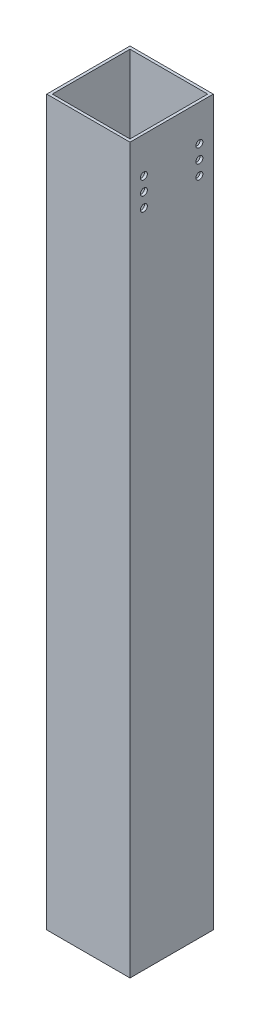
ISO-10303-21;
HEADER;
FILE_DESCRIPTION(('STEP AP214'),'2;1');
FILE_NAME('part.step','',(''),(''),'','','');
FILE_SCHEMA(('AUTOMOTIVE_DESIGN { 1 0 10303 214 1 1 1 1 }'));
ENDSEC;
DATA;
#1=APPLICATION_CONTEXT('core data for automotive mechanical design processes');
#2=APPLICATION_PROTOCOL_DEFINITION('international standard','automotive_design',2000,#1);
#3=PRODUCT_CONTEXT('',#1,'mechanical');
#4=PRODUCT('Part','Part','',(#3));
#5=PRODUCT_RELATED_PRODUCT_CATEGORY('part','',(#4));
#6=PRODUCT_DEFINITION_FORMATION('','',#4);
#7=PRODUCT_DEFINITION_CONTEXT('part definition',#1,'design');
#8=PRODUCT_DEFINITION('design','',#6,#7);
#9=PRODUCT_DEFINITION_SHAPE('','',#8);
#10=(LENGTH_UNIT() NAMED_UNIT(*) SI_UNIT(.MILLI.,.METRE.));
#11=(NAMED_UNIT(*) PLANE_ANGLE_UNIT() SI_UNIT($,.RADIAN.));
#12=(NAMED_UNIT(*) SI_UNIT($,.STERADIAN.) SOLID_ANGLE_UNIT());
#13=UNCERTAINTY_MEASURE_WITH_UNIT(LENGTH_MEASURE(1.E-05),#10,'distance_accuracy_value','');
#14=(GEOMETRIC_REPRESENTATION_CONTEXT(3) GLOBAL_UNCERTAINTY_ASSIGNED_CONTEXT((#13)) GLOBAL_UNIT_ASSIGNED_CONTEXT((#10,
#11,#12)) REPRESENTATION_CONTEXT('',''));
#15=CARTESIAN_POINT('',(0.,0.,0.));
#16=DIRECTION('',(0.,0.,1.));
#17=DIRECTION('',(1.,0.,0.));
#18=AXIS2_PLACEMENT_3D('',#15,#16,#17);
#19=CARTESIAN_POINT('',(0.,2707.5,0.));
#20=DIRECTION('',(0.,1.,0.));
#21=DIRECTION('',(0.,0.,1.));
#22=AXIS2_PLACEMENT_3D('',#19,#20,#21);
#23=PLANE('',#22);
#24=DIRECTION('',(0.,0.,-1.));
#25=VECTOR('',#24,1.);
#26=CARTESIAN_POINT('',(150.,2707.5,150.));
#27=LINE('',#26,#25);
#28=CARTESIAN_POINT('',(150.,2707.5,150.));
#29=VERTEX_POINT('',#28);
#30=CARTESIAN_POINT('',(150.,2707.5,-150.));
#31=VERTEX_POINT('',#30);
#32=EDGE_CURVE('E214',#29,#31,#27,.T.);
#33=ORIENTED_EDGE('',*,*,#32,.T.);
#34=DIRECTION('',(-1.,0.,0.));
#35=VECTOR('',#34,1.);
#36=CARTESIAN_POINT('',(-150.,2707.5,-150.));
#37=LINE('',#36,#35);
#38=CARTESIAN_POINT('',(-150.,2707.5,-150.));
#39=VERTEX_POINT('',#38);
#40=EDGE_CURVE('E218',#31,#39,#37,.T.);
#41=ORIENTED_EDGE('',*,*,#40,.T.);
#42=DIRECTION('',(0.,0.,1.));
#43=VECTOR('',#42,1.);
#44=CARTESIAN_POINT('',(-150.,2707.5,150.));
#45=LINE('',#44,#43);
#46=CARTESIAN_POINT('',(-150.,2707.5,150.));
#47=VERTEX_POINT('',#46);
#48=EDGE_CURVE('E124',#39,#47,#45,.T.);
#49=ORIENTED_EDGE('',*,*,#48,.T.);
#50=DIRECTION('',(1.,0.,0.));
#51=VECTOR('',#50,1.);
#52=CARTESIAN_POINT('',(-150.,2707.5,150.));
#53=LINE('',#52,#51);
#54=EDGE_CURVE('E223',#47,#29,#53,.T.);
#55=ORIENTED_EDGE('',*,*,#54,.T.);
#56=EDGE_LOOP('',(#33,#41,#49,#55));
#57=FACE_BOUND('',#56,.T.);
#58=DIRECTION('',(-1.,0.,0.));
#59=VECTOR('',#58,1.);
#60=CARTESIAN_POINT('',(0.,2707.5,-140.));
#61=LINE('',#60,#59);
#62=CARTESIAN_POINT('',(140.,2707.5,-140.));
#63=VERTEX_POINT('',#62);
#64=CARTESIAN_POINT('',(-140.,2707.5,-140.));
#65=VERTEX_POINT('',#64);
#66=EDGE_CURVE('E188',#63,#65,#61,.T.);
#67=ORIENTED_EDGE('',*,*,#66,.F.);
#68=DIRECTION('',(0.,0.,-1.));
#69=VECTOR('',#68,1.);
#70=CARTESIAN_POINT('',(140.,2707.5,0.));
#71=LINE('',#70,#69);
#72=CARTESIAN_POINT('',(140.,2707.5,140.));
#73=VERTEX_POINT('',#72);
#74=EDGE_CURVE('E185',#73,#63,#71,.T.);
#75=ORIENTED_EDGE('',*,*,#74,.F.);
#76=DIRECTION('',(1.,0.,0.));
#77=VECTOR('',#76,1.);
#78=CARTESIAN_POINT('',(0.,2707.5,140.));
#79=LINE('',#78,#77);
#80=CARTESIAN_POINT('',(-140.,2707.5,140.));
#81=VERTEX_POINT('',#80);
#82=EDGE_CURVE('E195',#81,#73,#79,.T.);
#83=ORIENTED_EDGE('',*,*,#82,.F.);
#84=DIRECTION('',(0.,0.,1.));
#85=VECTOR('',#84,1.);
#86=CARTESIAN_POINT('',(-140.,2707.5,0.));
#87=LINE('',#86,#85);
#88=EDGE_CURVE('E191',#65,#81,#87,.T.);
#89=ORIENTED_EDGE('',*,*,#88,.F.);
#90=EDGE_LOOP('',(#67,#75,#83,#89));
#91=FACE_BOUND('',#90,.T.);
#92=ADVANCED_FACE('F38',(#57,#91),#23,.T.);
#93=CARTESIAN_POINT('',(-150.,2707.5,-150.));
#94=DIRECTION('',(0.,0.,1.));
#95=DIRECTION('',(1.,0.,0.));
#96=AXIS2_PLACEMENT_3D('',#93,#94,#95);
#97=PLANE('',#96);
#98=DIRECTION('',(0.,-1.,0.));
#99=VECTOR('',#98,1.);
#100=CARTESIAN_POINT('',(150.,2707.5,-150.));
#101=LINE('',#100,#99);
#102=CARTESIAN_POINT('',(150.,100.000000000001,-150.));
#103=VERTEX_POINT('',#102);
#104=EDGE_CURVE('E11',#31,#103,#101,.T.);
#105=ORIENTED_EDGE('',*,*,#104,.T.);
#106=DIRECTION('',(-1.,0.,0.));
#107=VECTOR('',#106,1.);
#108=CARTESIAN_POINT('',(-150.,100.,-150.));
#109=LINE('',#108,#107);
#110=CARTESIAN_POINT('',(-150.,100.,-150.));
#111=VERTEX_POINT('',#110);
#112=EDGE_CURVE('E64',#103,#111,#109,.T.);
#113=ORIENTED_EDGE('',*,*,#112,.T.);
#114=DIRECTION('',(0.,-1.,0.));
#115=VECTOR('',#114,1.);
#116=CARTESIAN_POINT('',(-150.,2707.5,-150.));
#117=LINE('',#116,#115);
#118=EDGE_CURVE('E48',#39,#111,#117,.T.);
#119=ORIENTED_EDGE('',*,*,#118,.F.);
#120=ORIENTED_EDGE('',*,*,#40,.F.);
#121=EDGE_LOOP('',(#105,#113,#119,#120));
#122=FACE_BOUND('',#121,.T.);
#123=ADVANCED_FACE('F118',(#122),#97,.F.);
#124=CARTESIAN_POINT('',(-150.,2707.5,150.));
#125=DIRECTION('',(1.,0.,0.));
#126=DIRECTION('',(0.,0.,-1.));
#127=AXIS2_PLACEMENT_3D('',#124,#125,#126);
#128=PLANE('',#127);
#129=ORIENTED_EDGE('',*,*,#118,.T.);
#130=DIRECTION('',(0.,0.,1.));
#131=VECTOR('',#130,1.);
#132=CARTESIAN_POINT('',(-150.,100.,-150.));
#133=LINE('',#132,#131);
#134=CARTESIAN_POINT('',(-150.,100.,150.));
#135=VERTEX_POINT('',#134);
#136=EDGE_CURVE('E104',#111,#135,#133,.T.);
#137=ORIENTED_EDGE('',*,*,#136,.T.);
#138=DIRECTION('',(0.,-1.,0.));
#139=VECTOR('',#138,1.);
#140=CARTESIAN_POINT('',(-150.,2707.5,150.));
#141=LINE('',#140,#139);
#142=EDGE_CURVE('E126',#47,#135,#141,.T.);
#143=ORIENTED_EDGE('',*,*,#142,.F.);
#144=ORIENTED_EDGE('',*,*,#48,.F.);
#145=EDGE_LOOP('',(#129,#137,#143,#144));
#146=FACE_BOUND('',#145,.T.);
#147=ADVANCED_FACE('F123',(#146),#128,.F.);
#148=CARTESIAN_POINT('',(-150.,2707.5,150.));
#149=DIRECTION('',(0.,0.,-1.));
#150=DIRECTION('',(-1.,0.,0.));
#151=AXIS2_PLACEMENT_3D('',#148,#149,#150);
#152=PLANE('',#151);
#153=ORIENTED_EDGE('',*,*,#142,.T.);
#154=DIRECTION('',(-1.,0.,0.));
#155=VECTOR('',#154,1.);
#156=CARTESIAN_POINT('',(-150.,100.,150.));
#157=LINE('',#156,#155);
#158=CARTESIAN_POINT('',(150.,100.,150.));
#159=VERTEX_POINT('',#158);
#160=EDGE_CURVE('E107',#159,#135,#157,.T.);
#161=ORIENTED_EDGE('',*,*,#160,.F.);
#162=DIRECTION('',(0.,-1.,0.));
#163=VECTOR('',#162,1.);
#164=CARTESIAN_POINT('',(150.,2707.5,150.));
#165=LINE('',#164,#163);
#166=EDGE_CURVE('E129',#29,#159,#165,.T.);
#167=ORIENTED_EDGE('',*,*,#166,.F.);
#168=ORIENTED_EDGE('',*,*,#54,.F.);
#169=EDGE_LOOP('',(#153,#161,#167,#168));
#170=FACE_BOUND('',#169,.T.);
#171=ADVANCED_FACE('F232',(#170),#152,.F.);
#172=CARTESIAN_POINT('',(140.,2707.5,0.));
#173=DIRECTION('',(-1.,0.,0.));
#174=DIRECTION('',(0.,0.,1.));
#175=AXIS2_PLACEMENT_3D('',#172,#173,#174);
#176=PLANE('',#175);
#177=DIRECTION('',(0.,0.,-1.));
#178=VECTOR('',#177,1.);
#179=CARTESIAN_POINT('',(140.,100.,0.));
#180=LINE('',#179,#178);
#181=CARTESIAN_POINT('',(140.,100.,140.));
#182=VERTEX_POINT('',#181);
#183=CARTESIAN_POINT('',(140.,100.,-140.));
#184=VERTEX_POINT('',#183);
#185=EDGE_CURVE('E169',#182,#184,#180,.T.);
#186=ORIENTED_EDGE('',*,*,#185,.F.);
#187=DIRECTION('',(0.,-1.,0.));
#188=VECTOR('',#187,1.);
#189=CARTESIAN_POINT('',(140.,2707.5,140.));
#190=LINE('',#189,#188);
#191=EDGE_CURVE('E198',#73,#182,#190,.T.);
#192=ORIENTED_EDGE('',*,*,#191,.F.);
#193=ORIENTED_EDGE('',*,*,#74,.T.);
#194=DIRECTION('',(0.,-1.,0.));
#195=VECTOR('',#194,1.);
#196=CARTESIAN_POINT('',(140.,2707.5,-140.));
#197=LINE('',#196,#195);
#198=EDGE_CURVE('E210',#63,#184,#197,.T.);
#199=ORIENTED_EDGE('',*,*,#198,.T.);
#200=EDGE_LOOP('',(#186,#192,#193,#199));
#201=FACE_BOUND('',#200,.T.);
#202=CARTESIAN_POINT('',(140.,2577.5,-100.));
#203=DIRECTION('',(-1.,0.,0.));
#204=DIRECTION('',(0.,0.,1.));
#205=AXIS2_PLACEMENT_3D('',#202,#203,#204);
#206=CIRCLE('',#205,12.5000000000002);
#207=CARTESIAN_POINT('',(140.,2577.5,-112.5));
#208=VERTEX_POINT('',#207);
#209=EDGE_CURVE('E42',#208,#208,#206,.T.);
#210=ORIENTED_EDGE('',*,*,#209,.F.);
#211=EDGE_LOOP('',(#210));
#212=FACE_BOUND('',#211,.T.);
#213=CARTESIAN_POINT('',(140.,2527.5,-100.));
#214=DIRECTION('',(-1.,0.,0.));
#215=DIRECTION('',(0.,0.,1.));
#216=AXIS2_PLACEMENT_3D('',#213,#214,#215);
#217=CIRCLE('',#216,12.5000000000002);
#218=CARTESIAN_POINT('',(140.,2527.5,-112.5));
#219=VERTEX_POINT('',#218);
#220=EDGE_CURVE('E153',#219,#219,#217,.T.);
#221=ORIENTED_EDGE('',*,*,#220,.F.);
#222=EDGE_LOOP('',(#221));
#223=FACE_BOUND('',#222,.T.);
#224=CARTESIAN_POINT('',(140.,2477.5,-100.));
#225=DIRECTION('',(-1.,0.,0.));
#226=DIRECTION('',(0.,0.,1.));
#227=AXIS2_PLACEMENT_3D('',#224,#225,#226);
#228=CIRCLE('',#227,12.5000000000002);
#229=CARTESIAN_POINT('',(140.,2477.5,-112.5));
#230=VERTEX_POINT('',#229);
#231=EDGE_CURVE('E149',#230,#230,#228,.T.);
#232=ORIENTED_EDGE('',*,*,#231,.F.);
#233=EDGE_LOOP('',(#232));
#234=FACE_BOUND('',#233,.T.);
#235=CARTESIAN_POINT('',(140.,2577.5,100.));
#236=DIRECTION('',(-1.,0.,0.));
#237=DIRECTION('',(0.,0.,1.));
#238=AXIS2_PLACEMENT_3D('',#235,#236,#237);
#239=CIRCLE('',#238,12.5000000000002);
#240=CARTESIAN_POINT('',(140.,2577.5,87.4999999999998));
#241=VERTEX_POINT('',#240);
#242=EDGE_CURVE('E144',#241,#241,#239,.T.);
#243=ORIENTED_EDGE('',*,*,#242,.F.);
#244=EDGE_LOOP('',(#243));
#245=FACE_BOUND('',#244,.T.);
#246=CARTESIAN_POINT('',(140.,2527.5,100.));
#247=DIRECTION('',(-1.,0.,0.));
#248=DIRECTION('',(0.,0.,1.));
#249=AXIS2_PLACEMENT_3D('',#246,#247,#248);
#250=CIRCLE('',#249,12.5000000000002);
#251=CARTESIAN_POINT('',(140.,2527.5,87.4999999999998));
#252=VERTEX_POINT('',#251);
#253=EDGE_CURVE('E139',#252,#252,#250,.T.);
#254=ORIENTED_EDGE('',*,*,#253,.F.);
#255=EDGE_LOOP('',(#254));
#256=FACE_BOUND('',#255,.T.);
#257=CARTESIAN_POINT('',(140.,2477.5,100.));
#258=DIRECTION('',(-1.,0.,0.));
#259=DIRECTION('',(0.,0.,1.));
#260=AXIS2_PLACEMENT_3D('',#257,#258,#259);
#261=CIRCLE('',#260,12.5000000000002);
#262=CARTESIAN_POINT('',(140.,2477.5,87.4999999999998));
#263=VERTEX_POINT('',#262);
#264=EDGE_CURVE('E137',#263,#263,#261,.T.);
#265=ORIENTED_EDGE('',*,*,#264,.F.);
#266=EDGE_LOOP('',(#265));
#267=FACE_BOUND('',#266,.T.);
#268=ADVANCED_FACE('F253',(#201,#212,#223,#234,#245,#256,#267),#176,.T.);
#269=CARTESIAN_POINT('',(0.,2707.5,-140.));
#270=DIRECTION('',(0.,0.,1.));
#271=DIRECTION('',(1.,0.,0.));
#272=AXIS2_PLACEMENT_3D('',#269,#270,#271);
#273=PLANE('',#272);
#274=DIRECTION('',(-1.,0.,0.));
#275=VECTOR('',#274,1.);
#276=CARTESIAN_POINT('',(7.23726634177524E-13,100.,-140.));
#277=LINE('',#276,#275);
#278=CARTESIAN_POINT('',(-140.,100.,-140.));
#279=VERTEX_POINT('',#278);
#280=EDGE_CURVE('E241',#184,#279,#277,.T.);
#281=ORIENTED_EDGE('',*,*,#280,.F.);
#282=ORIENTED_EDGE('',*,*,#198,.F.);
#283=ORIENTED_EDGE('',*,*,#66,.T.);
#284=DIRECTION('',(0.,-1.,0.));
#285=VECTOR('',#284,1.);
#286=CARTESIAN_POINT('',(-140.,2707.5,-140.));
#287=LINE('',#286,#285);
#288=EDGE_CURVE('E206',#65,#279,#287,.T.);
#289=ORIENTED_EDGE('',*,*,#288,.T.);
#290=EDGE_LOOP('',(#281,#282,#283,#289));
#291=FACE_BOUND('',#290,.T.);
#292=ADVANCED_FACE('F250',(#291),#273,.T.);
#293=CARTESIAN_POINT('',(-140.,2707.5,0.));
#294=DIRECTION('',(1.,0.,0.));
#295=DIRECTION('',(0.,0.,-1.));
#296=AXIS2_PLACEMENT_3D('',#293,#294,#295);
#297=PLANE('',#296);
#298=DIRECTION('',(0.,0.,1.));
#299=VECTOR('',#298,1.);
#300=CARTESIAN_POINT('',(-140.,100.,0.));
#301=LINE('',#300,#299);
#302=CARTESIAN_POINT('',(-140.,100.000000000001,140.));
#303=VERTEX_POINT('',#302);
#304=EDGE_CURVE('E56',#279,#303,#301,.T.);
#305=ORIENTED_EDGE('',*,*,#304,.F.);
#306=ORIENTED_EDGE('',*,*,#288,.F.);
#307=ORIENTED_EDGE('',*,*,#88,.T.);
#308=DIRECTION('',(0.,-1.,0.));
#309=VECTOR('',#308,1.);
#310=CARTESIAN_POINT('',(-140.,2707.5,140.));
#311=LINE('',#310,#309);
#312=EDGE_CURVE('E202',#81,#303,#311,.T.);
#313=ORIENTED_EDGE('',*,*,#312,.T.);
#314=EDGE_LOOP('',(#305,#306,#307,#313));
#315=FACE_BOUND('',#314,.T.);
#316=ADVANCED_FACE('F260',(#315),#297,.T.);
#317=CARTESIAN_POINT('',(0.,2707.5,140.));
#318=DIRECTION('',(0.,0.,-1.));
#319=DIRECTION('',(-1.,0.,0.));
#320=AXIS2_PLACEMENT_3D('',#317,#318,#319);
#321=PLANE('',#320);
#322=DIRECTION('',(1.,0.,0.));
#323=VECTOR('',#322,1.);
#324=CARTESIAN_POINT('',(7.23726634177524E-13,100.,140.));
#325=LINE('',#324,#323);
#326=EDGE_CURVE('E113',#303,#182,#325,.T.);
#327=ORIENTED_EDGE('',*,*,#326,.F.);
#328=ORIENTED_EDGE('',*,*,#312,.F.);
#329=ORIENTED_EDGE('',*,*,#82,.T.);
#330=ORIENTED_EDGE('',*,*,#191,.T.);
#331=EDGE_LOOP('',(#327,#328,#329,#330));
#332=FACE_BOUND('',#331,.T.);
#333=ADVANCED_FACE('F262',(#332),#321,.T.);
#334=CARTESIAN_POINT('',(160.,2477.5,100.));
#335=DIRECTION('',(1.,0.,0.));
#336=DIRECTION('',(0.,0.,-1.));
#337=AXIS2_PLACEMENT_3D('',#334,#335,#336);
#338=CYLINDRICAL_SURFACE('',#337,12.5000000000002);
#339=CARTESIAN_POINT('',(150.,2477.5,100.));
#340=DIRECTION('',(-1.,0.,0.));
#341=DIRECTION('',(0.,0.,1.));
#342=AXIS2_PLACEMENT_3D('',#339,#340,#341);
#343=CIRCLE('',#342,12.5000000000002);
#344=CARTESIAN_POINT('',(150.,2477.5,87.4999999999998));
#345=VERTEX_POINT('',#344);
#346=EDGE_CURVE('E133',#345,#345,#343,.T.);
#347=CARTESIAN_POINT('',(140.,2477.5,87.4999999999998));
#348=CARTESIAN_POINT('',(140.104166666667,2477.5,87.4999999999998));
#349=CARTESIAN_POINT('',(140.208333333333,2477.5,87.4999999999998));
#350=CARTESIAN_POINT('',(140.416666666667,2477.5,87.4999999999998));
#351=CARTESIAN_POINT('',(140.520833333333,2477.5,87.4999999999998));
#352=CARTESIAN_POINT('',(140.729166666667,2477.5,87.4999999999998));
#353=CARTESIAN_POINT('',(140.833333333333,2477.5,87.4999999999998));
#354=CARTESIAN_POINT('',(141.041666666667,2477.5,87.4999999999998));
#355=CARTESIAN_POINT('',(141.145833333333,2477.5,87.4999999999998));
#356=CARTESIAN_POINT('',(141.354166666667,2477.5,87.4999999999998));
#357=CARTESIAN_POINT('',(141.458333333333,2477.5,87.4999999999998));
#358=CARTESIAN_POINT('',(141.666666666667,2477.5,87.4999999999998));
#359=CARTESIAN_POINT('',(141.770833333333,2477.5,87.4999999999998));
#360=CARTESIAN_POINT('',(141.979166666667,2477.5,87.4999999999998));
#361=CARTESIAN_POINT('',(142.083333333333,2477.5,87.4999999999998));
#362=CARTESIAN_POINT('',(142.291666666667,2477.5,87.4999999999998));
#363=CARTESIAN_POINT('',(142.395833333333,2477.5,87.4999999999998));
#364=CARTESIAN_POINT('',(142.604166666667,2477.5,87.4999999999998));
#365=CARTESIAN_POINT('',(142.708333333333,2477.5,87.4999999999998));
#366=CARTESIAN_POINT('',(142.916666666667,2477.5,87.4999999999998));
#367=CARTESIAN_POINT('',(143.020833333333,2477.5,87.4999999999998));
#368=CARTESIAN_POINT('',(143.229166666667,2477.5,87.4999999999998));
#369=CARTESIAN_POINT('',(143.333333333333,2477.5,87.4999999999998));
#370=CARTESIAN_POINT('',(143.541666666667,2477.5,87.4999999999998));
#371=CARTESIAN_POINT('',(143.645833333333,2477.5,87.4999999999998));
#372=CARTESIAN_POINT('',(143.854166666667,2477.5,87.4999999999998));
#373=CARTESIAN_POINT('',(143.958333333333,2477.5,87.4999999999998));
#374=CARTESIAN_POINT('',(144.166666666667,2477.5,87.4999999999998));
#375=CARTESIAN_POINT('',(144.270833333333,2477.5,87.4999999999998));
#376=CARTESIAN_POINT('',(144.479166666667,2477.5,87.4999999999998));
#377=CARTESIAN_POINT('',(144.583333333333,2477.5,87.4999999999998));
#378=CARTESIAN_POINT('',(144.791666666667,2477.5,87.4999999999998));
#379=CARTESIAN_POINT('',(144.895833333333,2477.5,87.4999999999998));
#380=CARTESIAN_POINT('',(145.104166666667,2477.5,87.4999999999998));
#381=CARTESIAN_POINT('',(145.208333333333,2477.5,87.4999999999998));
#382=CARTESIAN_POINT('',(145.416666666667,2477.5,87.4999999999998));
#383=CARTESIAN_POINT('',(145.520833333333,2477.5,87.4999999999998));
#384=CARTESIAN_POINT('',(145.729166666667,2477.5,87.4999999999998));
#385=CARTESIAN_POINT('',(145.833333333333,2477.5,87.4999999999998));
#386=CARTESIAN_POINT('',(146.041666666667,2477.5,87.4999999999998));
#387=CARTESIAN_POINT('',(146.145833333333,2477.5,87.4999999999998));
#388=CARTESIAN_POINT('',(146.354166666667,2477.5,87.4999999999998));
#389=CARTESIAN_POINT('',(146.458333333333,2477.5,87.4999999999998));
#390=CARTESIAN_POINT('',(146.666666666667,2477.5,87.4999999999998));
#391=CARTESIAN_POINT('',(146.770833333333,2477.5,87.4999999999998));
#392=CARTESIAN_POINT('',(146.979166666667,2477.5,87.4999999999998));
#393=CARTESIAN_POINT('',(147.083333333333,2477.5,87.4999999999998));
#394=CARTESIAN_POINT('',(147.291666666667,2477.5,87.4999999999998));
#395=CARTESIAN_POINT('',(147.395833333333,2477.5,87.4999999999998));
#396=CARTESIAN_POINT('',(147.604166666667,2477.5,87.4999999999998));
#397=CARTESIAN_POINT('',(147.708333333333,2477.5,87.4999999999998));
#398=CARTESIAN_POINT('',(147.916666666667,2477.5,87.4999999999998));
#399=CARTESIAN_POINT('',(148.020833333333,2477.5,87.4999999999998));
#400=CARTESIAN_POINT('',(148.229166666667,2477.5,87.4999999999998));
#401=CARTESIAN_POINT('',(148.333333333333,2477.5,87.4999999999998));
#402=CARTESIAN_POINT('',(148.541666666667,2477.5,87.4999999999998));
#403=CARTESIAN_POINT('',(148.645833333333,2477.5,87.4999999999998));
#404=CARTESIAN_POINT('',(148.854166666667,2477.5,87.4999999999998));
#405=CARTESIAN_POINT('',(148.958333333333,2477.5,87.4999999999998));
#406=CARTESIAN_POINT('',(149.166666666667,2477.5,87.4999999999998));
#407=CARTESIAN_POINT('',(149.270833333333,2477.5,87.4999999999998));
#408=CARTESIAN_POINT('',(149.479166666667,2477.5,87.4999999999998));
#409=CARTESIAN_POINT('',(149.583333333333,2477.5,87.4999999999998));
#410=CARTESIAN_POINT('',(149.791666666667,2477.5,87.4999999999998));
#411=CARTESIAN_POINT('',(149.895833333333,2477.5,87.4999999999998));
#412=CARTESIAN_POINT('',(150.,2477.5,87.4999999999998));
#413=B_SPLINE_CURVE_WITH_KNOTS('',3,(#347,#348,#349,#350,#351,#352,#353,#354,#355,#356,#357,
#358,#359,#360,#361,#362,#363,#364,#365,#366,#367,#368,#369,#370,#371,#372,#373,#374,#375,#376,
#377,#378,#379,#380,#381,#382,#383,#384,#385,#386,#387,#388,#389,#390,#391,#392,#393,#394,#395,
#396,#397,#398,#399,#400,#401,#402,#403,#404,#405,#406,#407,#408,#409,#410,#411,#412),
.UNSPECIFIED.,.F.,.F.,(4,2,2,2,2,2,2,2,2,2,2,2,2,2,2,2,2,2,2,2,2,2,2,2,2,2,2,2,2,2,2,2,4),(0.,
0.312500000000021,0.625000000000014,0.937500000000008,1.25000000000003,1.56250000000002,
1.87500000000002,2.18750000000001,2.5,2.81250000000002,3.12500000000002,3.43750000000001,
3.75000000000003,4.06250000000002,4.37500000000002,4.68750000000001,5.,5.31250000000003,
5.62500000000002,5.93750000000001,6.25000000000003,6.56250000000003,6.87500000000002,
7.18750000000001,7.50000000000001,7.81250000000003,8.12500000000002,8.43750000000001,
8.75000000000004,9.06250000000003,9.37500000000002,9.68750000000002,10.),.UNSPECIFIED.);
#414=EDGE_CURVE('BSEAM264',#263,#345,#413,.T.);
#415=ORIENTED_EDGE('',*,*,#264,.T.);
#416=ORIENTED_EDGE('',*,*,#346,.F.);
#417=ORIENTED_EDGE('',*,*,#414,.T.);
#418=ORIENTED_EDGE('',*,*,#414,.F.);
#419=EDGE_LOOP('',(#415,#417,#416,#418));
#420=FACE_BOUND('',#419,.T.);
#421=ADVANCED_FACE('F264',(#420),#338,.F.);
#422=CARTESIAN_POINT('',(160.,2527.5,100.));
#423=DIRECTION('',(1.,0.,0.));
#424=DIRECTION('',(0.,0.,-1.));
#425=AXIS2_PLACEMENT_3D('',#422,#423,#424);
#426=CYLINDRICAL_SURFACE('',#425,12.5000000000002);
#427=CARTESIAN_POINT('',(150.,2527.5,100.));
#428=DIRECTION('',(-1.,0.,0.));
#429=DIRECTION('',(0.,0.,1.));
#430=AXIS2_PLACEMENT_3D('',#427,#428,#429);
#431=CIRCLE('',#430,12.5000000000002);
#432=CARTESIAN_POINT('',(150.,2527.5,87.4999999999998));
#433=VERTEX_POINT('',#432);
#434=EDGE_CURVE('E138',#433,#433,#431,.T.);
#435=CARTESIAN_POINT('',(140.,2527.5,87.4999999999998));
#436=CARTESIAN_POINT('',(140.104166666667,2527.5,87.4999999999998));
#437=CARTESIAN_POINT('',(140.208333333333,2527.5,87.4999999999998));
#438=CARTESIAN_POINT('',(140.416666666667,2527.5,87.4999999999998));
#439=CARTESIAN_POINT('',(140.520833333333,2527.5,87.4999999999998));
#440=CARTESIAN_POINT('',(140.729166666667,2527.5,87.4999999999998));
#441=CARTESIAN_POINT('',(140.833333333333,2527.5,87.4999999999998));
#442=CARTESIAN_POINT('',(141.041666666667,2527.5,87.4999999999998));
#443=CARTESIAN_POINT('',(141.145833333333,2527.5,87.4999999999998));
#444=CARTESIAN_POINT('',(141.354166666667,2527.5,87.4999999999998));
#445=CARTESIAN_POINT('',(141.458333333333,2527.5,87.4999999999998));
#446=CARTESIAN_POINT('',(141.666666666667,2527.5,87.4999999999998));
#447=CARTESIAN_POINT('',(141.770833333333,2527.5,87.4999999999998));
#448=CARTESIAN_POINT('',(141.979166666667,2527.5,87.4999999999998));
#449=CARTESIAN_POINT('',(142.083333333333,2527.5,87.4999999999998));
#450=CARTESIAN_POINT('',(142.291666666667,2527.5,87.4999999999998));
#451=CARTESIAN_POINT('',(142.395833333333,2527.5,87.4999999999998));
#452=CARTESIAN_POINT('',(142.604166666667,2527.5,87.4999999999998));
#453=CARTESIAN_POINT('',(142.708333333333,2527.5,87.4999999999998));
#454=CARTESIAN_POINT('',(142.916666666667,2527.5,87.4999999999998));
#455=CARTESIAN_POINT('',(143.020833333333,2527.5,87.4999999999998));
#456=CARTESIAN_POINT('',(143.229166666667,2527.5,87.4999999999998));
#457=CARTESIAN_POINT('',(143.333333333333,2527.5,87.4999999999998));
#458=CARTESIAN_POINT('',(143.541666666667,2527.5,87.4999999999998));
#459=CARTESIAN_POINT('',(143.645833333333,2527.5,87.4999999999998));
#460=CARTESIAN_POINT('',(143.854166666667,2527.5,87.4999999999998));
#461=CARTESIAN_POINT('',(143.958333333333,2527.5,87.4999999999998));
#462=CARTESIAN_POINT('',(144.166666666667,2527.5,87.4999999999998));
#463=CARTESIAN_POINT('',(144.270833333333,2527.5,87.4999999999998));
#464=CARTESIAN_POINT('',(144.479166666667,2527.5,87.4999999999998));
#465=CARTESIAN_POINT('',(144.583333333333,2527.5,87.4999999999998));
#466=CARTESIAN_POINT('',(144.791666666667,2527.5,87.4999999999998));
#467=CARTESIAN_POINT('',(144.895833333333,2527.5,87.4999999999998));
#468=CARTESIAN_POINT('',(145.104166666667,2527.5,87.4999999999998));
#469=CARTESIAN_POINT('',(145.208333333333,2527.5,87.4999999999998));
#470=CARTESIAN_POINT('',(145.416666666667,2527.5,87.4999999999998));
#471=CARTESIAN_POINT('',(145.520833333333,2527.5,87.4999999999998));
#472=CARTESIAN_POINT('',(145.729166666667,2527.5,87.4999999999998));
#473=CARTESIAN_POINT('',(145.833333333333,2527.5,87.4999999999998));
#474=CARTESIAN_POINT('',(146.041666666667,2527.5,87.4999999999998));
#475=CARTESIAN_POINT('',(146.145833333333,2527.5,87.4999999999998));
#476=CARTESIAN_POINT('',(146.354166666667,2527.5,87.4999999999998));
#477=CARTESIAN_POINT('',(146.458333333333,2527.5,87.4999999999998));
#478=CARTESIAN_POINT('',(146.666666666667,2527.5,87.4999999999998));
#479=CARTESIAN_POINT('',(146.770833333333,2527.5,87.4999999999998));
#480=CARTESIAN_POINT('',(146.979166666667,2527.5,87.4999999999998));
#481=CARTESIAN_POINT('',(147.083333333333,2527.5,87.4999999999998));
#482=CARTESIAN_POINT('',(147.291666666667,2527.5,87.4999999999998));
#483=CARTESIAN_POINT('',(147.395833333333,2527.5,87.4999999999998));
#484=CARTESIAN_POINT('',(147.604166666667,2527.5,87.4999999999998));
#485=CARTESIAN_POINT('',(147.708333333333,2527.5,87.4999999999998));
#486=CARTESIAN_POINT('',(147.916666666667,2527.5,87.4999999999998));
#487=CARTESIAN_POINT('',(148.020833333333,2527.5,87.4999999999998));
#488=CARTESIAN_POINT('',(148.229166666667,2527.5,87.4999999999998));
#489=CARTESIAN_POINT('',(148.333333333333,2527.5,87.4999999999998));
#490=CARTESIAN_POINT('',(148.541666666667,2527.5,87.4999999999998));
#491=CARTESIAN_POINT('',(148.645833333333,2527.5,87.4999999999998));
#492=CARTESIAN_POINT('',(148.854166666667,2527.5,87.4999999999998));
#493=CARTESIAN_POINT('',(148.958333333333,2527.5,87.4999999999998));
#494=CARTESIAN_POINT('',(149.166666666667,2527.5,87.4999999999998));
#495=CARTESIAN_POINT('',(149.270833333333,2527.5,87.4999999999998));
#496=CARTESIAN_POINT('',(149.479166666667,2527.5,87.4999999999998));
#497=CARTESIAN_POINT('',(149.583333333333,2527.5,87.4999999999998));
#498=CARTESIAN_POINT('',(149.791666666667,2527.5,87.4999999999998));
#499=CARTESIAN_POINT('',(149.895833333333,2527.5,87.4999999999998));
#500=CARTESIAN_POINT('',(150.,2527.5,87.4999999999998));
#501=B_SPLINE_CURVE_WITH_KNOTS('',3,(#435,#436,#437,#438,#439,#440,#441,#442,#443,#444,#445,
#446,#447,#448,#449,#450,#451,#452,#453,#454,#455,#456,#457,#458,#459,#460,#461,#462,#463,#464,
#465,#466,#467,#468,#469,#470,#471,#472,#473,#474,#475,#476,#477,#478,#479,#480,#481,#482,#483,
#484,#485,#486,#487,#488,#489,#490,#491,#492,#493,#494,#495,#496,#497,#498,#499,#500),
.UNSPECIFIED.,.F.,.F.,(4,2,2,2,2,2,2,2,2,2,2,2,2,2,2,2,2,2,2,2,2,2,2,2,2,2,2,2,2,2,2,2,4),(0.,
0.312500000000021,0.625000000000014,0.937500000000008,1.25000000000003,1.56250000000002,
1.87500000000002,2.18750000000001,2.5,2.81250000000002,3.12500000000002,3.43750000000001,
3.75000000000003,4.06250000000002,4.37500000000002,4.68750000000001,5.,5.31250000000003,
5.62500000000002,5.93750000000001,6.25000000000003,6.56250000000003,6.87500000000002,
7.18750000000001,7.50000000000001,7.81250000000003,8.12500000000002,8.43750000000001,
8.75000000000004,9.06250000000003,9.37500000000002,9.68750000000002,10.),.UNSPECIFIED.);
#502=EDGE_CURVE('BSEAM270',#252,#433,#501,.T.);
#503=ORIENTED_EDGE('',*,*,#253,.T.);
#504=ORIENTED_EDGE('',*,*,#434,.F.);
#505=ORIENTED_EDGE('',*,*,#502,.T.);
#506=ORIENTED_EDGE('',*,*,#502,.F.);
#507=EDGE_LOOP('',(#503,#505,#504,#506));
#508=FACE_BOUND('',#507,.T.);
#509=ADVANCED_FACE('F270',(#508),#426,.F.);
#510=CARTESIAN_POINT('',(160.,2577.5,100.));
#511=DIRECTION('',(1.,0.,0.));
#512=DIRECTION('',(0.,0.,-1.));
#513=AXIS2_PLACEMENT_3D('',#510,#511,#512);
#514=CYLINDRICAL_SURFACE('',#513,12.5000000000002);
#515=CARTESIAN_POINT('',(150.,2577.5,100.));
#516=DIRECTION('',(-1.,0.,0.));
#517=DIRECTION('',(0.,0.,1.));
#518=AXIS2_PLACEMENT_3D('',#515,#516,#517);
#519=CIRCLE('',#518,12.5000000000002);
#520=CARTESIAN_POINT('',(150.,2577.5,87.4999999999998));
#521=VERTEX_POINT('',#520);
#522=EDGE_CURVE('E143',#521,#521,#519,.T.);
#523=CARTESIAN_POINT('',(140.,2577.5,87.4999999999998));
#524=CARTESIAN_POINT('',(140.104166666667,2577.5,87.4999999999998));
#525=CARTESIAN_POINT('',(140.208333333333,2577.5,87.4999999999998));
#526=CARTESIAN_POINT('',(140.416666666667,2577.5,87.4999999999998));
#527=CARTESIAN_POINT('',(140.520833333333,2577.5,87.4999999999998));
#528=CARTESIAN_POINT('',(140.729166666667,2577.5,87.4999999999998));
#529=CARTESIAN_POINT('',(140.833333333333,2577.5,87.4999999999998));
#530=CARTESIAN_POINT('',(141.041666666667,2577.5,87.4999999999998));
#531=CARTESIAN_POINT('',(141.145833333333,2577.5,87.4999999999998));
#532=CARTESIAN_POINT('',(141.354166666667,2577.5,87.4999999999998));
#533=CARTESIAN_POINT('',(141.458333333333,2577.5,87.4999999999998));
#534=CARTESIAN_POINT('',(141.666666666667,2577.5,87.4999999999998));
#535=CARTESIAN_POINT('',(141.770833333333,2577.5,87.4999999999998));
#536=CARTESIAN_POINT('',(141.979166666667,2577.5,87.4999999999998));
#537=CARTESIAN_POINT('',(142.083333333333,2577.5,87.4999999999998));
#538=CARTESIAN_POINT('',(142.291666666667,2577.5,87.4999999999998));
#539=CARTESIAN_POINT('',(142.395833333333,2577.5,87.4999999999998));
#540=CARTESIAN_POINT('',(142.604166666667,2577.5,87.4999999999998));
#541=CARTESIAN_POINT('',(142.708333333333,2577.5,87.4999999999998));
#542=CARTESIAN_POINT('',(142.916666666667,2577.5,87.4999999999998));
#543=CARTESIAN_POINT('',(143.020833333333,2577.5,87.4999999999998));
#544=CARTESIAN_POINT('',(143.229166666667,2577.5,87.4999999999998));
#545=CARTESIAN_POINT('',(143.333333333333,2577.5,87.4999999999998));
#546=CARTESIAN_POINT('',(143.541666666667,2577.5,87.4999999999998));
#547=CARTESIAN_POINT('',(143.645833333333,2577.5,87.4999999999998));
#548=CARTESIAN_POINT('',(143.854166666667,2577.5,87.4999999999998));
#549=CARTESIAN_POINT('',(143.958333333333,2577.5,87.4999999999998));
#550=CARTESIAN_POINT('',(144.166666666667,2577.5,87.4999999999998));
#551=CARTESIAN_POINT('',(144.270833333333,2577.5,87.4999999999998));
#552=CARTESIAN_POINT('',(144.479166666667,2577.5,87.4999999999998));
#553=CARTESIAN_POINT('',(144.583333333333,2577.5,87.4999999999998));
#554=CARTESIAN_POINT('',(144.791666666667,2577.5,87.4999999999998));
#555=CARTESIAN_POINT('',(144.895833333333,2577.5,87.4999999999998));
#556=CARTESIAN_POINT('',(145.104166666667,2577.5,87.4999999999998));
#557=CARTESIAN_POINT('',(145.208333333333,2577.5,87.4999999999998));
#558=CARTESIAN_POINT('',(145.416666666667,2577.5,87.4999999999998));
#559=CARTESIAN_POINT('',(145.520833333333,2577.5,87.4999999999998));
#560=CARTESIAN_POINT('',(145.729166666667,2577.5,87.4999999999998));
#561=CARTESIAN_POINT('',(145.833333333333,2577.5,87.4999999999998));
#562=CARTESIAN_POINT('',(146.041666666667,2577.5,87.4999999999998));
#563=CARTESIAN_POINT('',(146.145833333333,2577.5,87.4999999999998));
#564=CARTESIAN_POINT('',(146.354166666667,2577.5,87.4999999999998));
#565=CARTESIAN_POINT('',(146.458333333333,2577.5,87.4999999999998));
#566=CARTESIAN_POINT('',(146.666666666667,2577.5,87.4999999999998));
#567=CARTESIAN_POINT('',(146.770833333333,2577.5,87.4999999999998));
#568=CARTESIAN_POINT('',(146.979166666667,2577.5,87.4999999999998));
#569=CARTESIAN_POINT('',(147.083333333333,2577.5,87.4999999999998));
#570=CARTESIAN_POINT('',(147.291666666667,2577.5,87.4999999999998));
#571=CARTESIAN_POINT('',(147.395833333333,2577.5,87.4999999999998));
#572=CARTESIAN_POINT('',(147.604166666667,2577.5,87.4999999999998));
#573=CARTESIAN_POINT('',(147.708333333333,2577.5,87.4999999999998));
#574=CARTESIAN_POINT('',(147.916666666667,2577.5,87.4999999999998));
#575=CARTESIAN_POINT('',(148.020833333333,2577.5,87.4999999999998));
#576=CARTESIAN_POINT('',(148.229166666667,2577.5,87.4999999999998));
#577=CARTESIAN_POINT('',(148.333333333333,2577.5,87.4999999999998));
#578=CARTESIAN_POINT('',(148.541666666667,2577.5,87.4999999999998));
#579=CARTESIAN_POINT('',(148.645833333333,2577.5,87.4999999999998));
#580=CARTESIAN_POINT('',(148.854166666667,2577.5,87.4999999999998));
#581=CARTESIAN_POINT('',(148.958333333333,2577.5,87.4999999999998));
#582=CARTESIAN_POINT('',(149.166666666667,2577.5,87.4999999999998));
#583=CARTESIAN_POINT('',(149.270833333333,2577.5,87.4999999999998));
#584=CARTESIAN_POINT('',(149.479166666667,2577.5,87.4999999999998));
#585=CARTESIAN_POINT('',(149.583333333333,2577.5,87.4999999999998));
#586=CARTESIAN_POINT('',(149.791666666667,2577.5,87.4999999999998));
#587=CARTESIAN_POINT('',(149.895833333333,2577.5,87.4999999999998));
#588=CARTESIAN_POINT('',(150.,2577.5,87.4999999999998));
#589=B_SPLINE_CURVE_WITH_KNOTS('',3,(#523,#524,#525,#526,#527,#528,#529,#530,#531,#532,#533,
#534,#535,#536,#537,#538,#539,#540,#541,#542,#543,#544,#545,#546,#547,#548,#549,#550,#551,#552,
#553,#554,#555,#556,#557,#558,#559,#560,#561,#562,#563,#564,#565,#566,#567,#568,#569,#570,#571,
#572,#573,#574,#575,#576,#577,#578,#579,#580,#581,#582,#583,#584,#585,#586,#587,#588),
.UNSPECIFIED.,.F.,.F.,(4,2,2,2,2,2,2,2,2,2,2,2,2,2,2,2,2,2,2,2,2,2,2,2,2,2,2,2,2,2,2,2,4),(0.,
0.312500000000021,0.625000000000014,0.937500000000008,1.25000000000003,1.56250000000002,
1.87500000000002,2.18750000000001,2.5,2.81250000000002,3.12500000000002,3.43750000000001,
3.75000000000003,4.06250000000002,4.37500000000002,4.68750000000001,5.,5.31250000000003,
5.62500000000002,5.93750000000001,6.25000000000003,6.56250000000003,6.87500000000002,
7.18750000000001,7.50000000000001,7.81250000000003,8.12500000000002,8.43750000000001,
8.75000000000004,9.06250000000003,9.37500000000002,9.68750000000002,10.),.UNSPECIFIED.);
#590=EDGE_CURVE('BSEAM357',#241,#521,#589,.T.);
#591=ORIENTED_EDGE('',*,*,#242,.T.);
#592=ORIENTED_EDGE('',*,*,#522,.F.);
#593=ORIENTED_EDGE('',*,*,#590,.T.);
#594=ORIENTED_EDGE('',*,*,#590,.F.);
#595=EDGE_LOOP('',(#591,#593,#592,#594));
#596=FACE_BOUND('',#595,.T.);
#597=ADVANCED_FACE('F357',(#596),#514,.F.);
#598=CARTESIAN_POINT('',(160.,2477.5,-100.));
#599=DIRECTION('',(1.,0.,0.));
#600=DIRECTION('',(0.,0.,-1.));
#601=AXIS2_PLACEMENT_3D('',#598,#599,#600);
#602=CYLINDRICAL_SURFACE('',#601,12.5000000000002);
#603=CARTESIAN_POINT('',(150.,2477.5,-100.));
#604=DIRECTION('',(-1.,0.,0.));
#605=DIRECTION('',(0.,0.,1.));
#606=AXIS2_PLACEMENT_3D('',#603,#604,#605);
#607=CIRCLE('',#606,12.5000000000002);
#608=CARTESIAN_POINT('',(150.,2477.5,-112.5));
#609=VERTEX_POINT('',#608);
#610=EDGE_CURVE('E148',#609,#609,#607,.T.);
#611=CARTESIAN_POINT('',(140.,2477.5,-112.5));
#612=CARTESIAN_POINT('',(140.104166666667,2477.5,-112.5));
#613=CARTESIAN_POINT('',(140.208333333333,2477.5,-112.5));
#614=CARTESIAN_POINT('',(140.416666666667,2477.5,-112.5));
#615=CARTESIAN_POINT('',(140.520833333333,2477.5,-112.5));
#616=CARTESIAN_POINT('',(140.729166666667,2477.5,-112.5));
#617=CARTESIAN_POINT('',(140.833333333333,2477.5,-112.5));
#618=CARTESIAN_POINT('',(141.041666666667,2477.5,-112.5));
#619=CARTESIAN_POINT('',(141.145833333333,2477.5,-112.5));
#620=CARTESIAN_POINT('',(141.354166666667,2477.5,-112.5));
#621=CARTESIAN_POINT('',(141.458333333333,2477.5,-112.5));
#622=CARTESIAN_POINT('',(141.666666666667,2477.5,-112.5));
#623=CARTESIAN_POINT('',(141.770833333333,2477.5,-112.5));
#624=CARTESIAN_POINT('',(141.979166666667,2477.5,-112.5));
#625=CARTESIAN_POINT('',(142.083333333333,2477.5,-112.5));
#626=CARTESIAN_POINT('',(142.291666666667,2477.5,-112.5));
#627=CARTESIAN_POINT('',(142.395833333333,2477.5,-112.5));
#628=CARTESIAN_POINT('',(142.604166666667,2477.5,-112.5));
#629=CARTESIAN_POINT('',(142.708333333333,2477.5,-112.5));
#630=CARTESIAN_POINT('',(142.916666666667,2477.5,-112.5));
#631=CARTESIAN_POINT('',(143.020833333333,2477.5,-112.5));
#632=CARTESIAN_POINT('',(143.229166666667,2477.5,-112.5));
#633=CARTESIAN_POINT('',(143.333333333333,2477.5,-112.5));
#634=CARTESIAN_POINT('',(143.541666666667,2477.5,-112.5));
#635=CARTESIAN_POINT('',(143.645833333333,2477.5,-112.5));
#636=CARTESIAN_POINT('',(143.854166666667,2477.5,-112.5));
#637=CARTESIAN_POINT('',(143.958333333333,2477.5,-112.5));
#638=CARTESIAN_POINT('',(144.166666666667,2477.5,-112.5));
#639=CARTESIAN_POINT('',(144.270833333333,2477.5,-112.5));
#640=CARTESIAN_POINT('',(144.479166666667,2477.5,-112.5));
#641=CARTESIAN_POINT('',(144.583333333333,2477.5,-112.5));
#642=CARTESIAN_POINT('',(144.791666666667,2477.5,-112.5));
#643=CARTESIAN_POINT('',(144.895833333333,2477.5,-112.5));
#644=CARTESIAN_POINT('',(145.104166666667,2477.5,-112.5));
#645=CARTESIAN_POINT('',(145.208333333333,2477.5,-112.5));
#646=CARTESIAN_POINT('',(145.416666666667,2477.5,-112.5));
#647=CARTESIAN_POINT('',(145.520833333333,2477.5,-112.5));
#648=CARTESIAN_POINT('',(145.729166666667,2477.5,-112.5));
#649=CARTESIAN_POINT('',(145.833333333333,2477.5,-112.5));
#650=CARTESIAN_POINT('',(146.041666666667,2477.5,-112.5));
#651=CARTESIAN_POINT('',(146.145833333333,2477.5,-112.5));
#652=CARTESIAN_POINT('',(146.354166666667,2477.5,-112.5));
#653=CARTESIAN_POINT('',(146.458333333333,2477.5,-112.5));
#654=CARTESIAN_POINT('',(146.666666666667,2477.5,-112.5));
#655=CARTESIAN_POINT('',(146.770833333333,2477.5,-112.5));
#656=CARTESIAN_POINT('',(146.979166666667,2477.5,-112.5));
#657=CARTESIAN_POINT('',(147.083333333333,2477.5,-112.5));
#658=CARTESIAN_POINT('',(147.291666666667,2477.5,-112.5));
#659=CARTESIAN_POINT('',(147.395833333333,2477.5,-112.5));
#660=CARTESIAN_POINT('',(147.604166666667,2477.5,-112.5));
#661=CARTESIAN_POINT('',(147.708333333333,2477.5,-112.5));
#662=CARTESIAN_POINT('',(147.916666666667,2477.5,-112.5));
#663=CARTESIAN_POINT('',(148.020833333333,2477.5,-112.5));
#664=CARTESIAN_POINT('',(148.229166666667,2477.5,-112.5));
#665=CARTESIAN_POINT('',(148.333333333333,2477.5,-112.5));
#666=CARTESIAN_POINT('',(148.541666666667,2477.5,-112.5));
#667=CARTESIAN_POINT('',(148.645833333333,2477.5,-112.5));
#668=CARTESIAN_POINT('',(148.854166666667,2477.5,-112.5));
#669=CARTESIAN_POINT('',(148.958333333333,2477.5,-112.5));
#670=CARTESIAN_POINT('',(149.166666666667,2477.5,-112.5));
#671=CARTESIAN_POINT('',(149.270833333333,2477.5,-112.5));
#672=CARTESIAN_POINT('',(149.479166666667,2477.5,-112.5));
#673=CARTESIAN_POINT('',(149.583333333333,2477.5,-112.5));
#674=CARTESIAN_POINT('',(149.791666666667,2477.5,-112.5));
#675=CARTESIAN_POINT('',(149.895833333333,2477.5,-112.5));
#676=CARTESIAN_POINT('',(150.,2477.5,-112.5));
#677=B_SPLINE_CURVE_WITH_KNOTS('',3,(#611,#612,#613,#614,#615,#616,#617,#618,#619,#620,#621,
#622,#623,#624,#625,#626,#627,#628,#629,#630,#631,#632,#633,#634,#635,#636,#637,#638,#639,#640,
#641,#642,#643,#644,#645,#646,#647,#648,#649,#650,#651,#652,#653,#654,#655,#656,#657,#658,#659,
#660,#661,#662,#663,#664,#665,#666,#667,#668,#669,#670,#671,#672,#673,#674,#675,#676),
.UNSPECIFIED.,.F.,.F.,(4,2,2,2,2,2,2,2,2,2,2,2,2,2,2,2,2,2,2,2,2,2,2,2,2,2,2,2,2,2,2,2,4),(0.,
0.312500000000021,0.625000000000014,0.937500000000008,1.25000000000003,1.56250000000002,
1.87500000000002,2.18750000000001,2.5,2.81250000000002,3.12500000000002,3.43750000000001,
3.75000000000003,4.06250000000002,4.37500000000002,4.68750000000001,5.,5.31250000000003,
5.62500000000002,5.93750000000001,6.25000000000003,6.56250000000003,6.87500000000002,
7.18750000000001,7.50000000000001,7.81250000000003,8.12500000000002,8.43750000000001,
8.75000000000004,9.06250000000003,9.37500000000002,9.68750000000002,10.),.UNSPECIFIED.);
#678=EDGE_CURVE('BSEAM349',#230,#609,#677,.T.);
#679=ORIENTED_EDGE('',*,*,#231,.T.);
#680=ORIENTED_EDGE('',*,*,#610,.F.);
#681=ORIENTED_EDGE('',*,*,#678,.T.);
#682=ORIENTED_EDGE('',*,*,#678,.F.);
#683=EDGE_LOOP('',(#679,#681,#680,#682));
#684=FACE_BOUND('',#683,.T.);
#685=ADVANCED_FACE('F349',(#684),#602,.F.);
#686=CARTESIAN_POINT('',(160.,2527.5,-100.));
#687=DIRECTION('',(1.,0.,0.));
#688=DIRECTION('',(0.,0.,-1.));
#689=AXIS2_PLACEMENT_3D('',#686,#687,#688);
#690=CYLINDRICAL_SURFACE('',#689,12.5000000000002);
#691=CARTESIAN_POINT('',(150.,2527.5,-100.));
#692=DIRECTION('',(-1.,0.,0.));
#693=DIRECTION('',(0.,0.,1.));
#694=AXIS2_PLACEMENT_3D('',#691,#692,#693);
#695=CIRCLE('',#694,12.5000000000002);
#696=CARTESIAN_POINT('',(150.,2527.5,-112.5));
#697=VERTEX_POINT('',#696);
#698=EDGE_CURVE('E152',#697,#697,#695,.T.);
#699=CARTESIAN_POINT('',(140.,2527.5,-112.5));
#700=CARTESIAN_POINT('',(140.104166666667,2527.5,-112.5));
#701=CARTESIAN_POINT('',(140.208333333333,2527.5,-112.5));
#702=CARTESIAN_POINT('',(140.416666666667,2527.5,-112.5));
#703=CARTESIAN_POINT('',(140.520833333333,2527.5,-112.5));
#704=CARTESIAN_POINT('',(140.729166666667,2527.5,-112.5));
#705=CARTESIAN_POINT('',(140.833333333333,2527.5,-112.5));
#706=CARTESIAN_POINT('',(141.041666666667,2527.5,-112.5));
#707=CARTESIAN_POINT('',(141.145833333333,2527.5,-112.5));
#708=CARTESIAN_POINT('',(141.354166666667,2527.5,-112.5));
#709=CARTESIAN_POINT('',(141.458333333333,2527.5,-112.5));
#710=CARTESIAN_POINT('',(141.666666666667,2527.5,-112.5));
#711=CARTESIAN_POINT('',(141.770833333333,2527.5,-112.5));
#712=CARTESIAN_POINT('',(141.979166666667,2527.5,-112.5));
#713=CARTESIAN_POINT('',(142.083333333333,2527.5,-112.5));
#714=CARTESIAN_POINT('',(142.291666666667,2527.5,-112.5));
#715=CARTESIAN_POINT('',(142.395833333333,2527.5,-112.5));
#716=CARTESIAN_POINT('',(142.604166666667,2527.5,-112.5));
#717=CARTESIAN_POINT('',(142.708333333333,2527.5,-112.5));
#718=CARTESIAN_POINT('',(142.916666666667,2527.5,-112.5));
#719=CARTESIAN_POINT('',(143.020833333333,2527.5,-112.5));
#720=CARTESIAN_POINT('',(143.229166666667,2527.5,-112.5));
#721=CARTESIAN_POINT('',(143.333333333333,2527.5,-112.5));
#722=CARTESIAN_POINT('',(143.541666666667,2527.5,-112.5));
#723=CARTESIAN_POINT('',(143.645833333333,2527.5,-112.5));
#724=CARTESIAN_POINT('',(143.854166666667,2527.5,-112.5));
#725=CARTESIAN_POINT('',(143.958333333333,2527.5,-112.5));
#726=CARTESIAN_POINT('',(144.166666666667,2527.5,-112.5));
#727=CARTESIAN_POINT('',(144.270833333333,2527.5,-112.5));
#728=CARTESIAN_POINT('',(144.479166666667,2527.5,-112.5));
#729=CARTESIAN_POINT('',(144.583333333333,2527.5,-112.5));
#730=CARTESIAN_POINT('',(144.791666666667,2527.5,-112.5));
#731=CARTESIAN_POINT('',(144.895833333333,2527.5,-112.5));
#732=CARTESIAN_POINT('',(145.104166666667,2527.5,-112.5));
#733=CARTESIAN_POINT('',(145.208333333333,2527.5,-112.5));
#734=CARTESIAN_POINT('',(145.416666666667,2527.5,-112.5));
#735=CARTESIAN_POINT('',(145.520833333333,2527.5,-112.5));
#736=CARTESIAN_POINT('',(145.729166666667,2527.5,-112.5));
#737=CARTESIAN_POINT('',(145.833333333333,2527.5,-112.5));
#738=CARTESIAN_POINT('',(146.041666666667,2527.5,-112.5));
#739=CARTESIAN_POINT('',(146.145833333333,2527.5,-112.5));
#740=CARTESIAN_POINT('',(146.354166666667,2527.5,-112.5));
#741=CARTESIAN_POINT('',(146.458333333333,2527.5,-112.5));
#742=CARTESIAN_POINT('',(146.666666666667,2527.5,-112.5));
#743=CARTESIAN_POINT('',(146.770833333333,2527.5,-112.5));
#744=CARTESIAN_POINT('',(146.979166666667,2527.5,-112.5));
#745=CARTESIAN_POINT('',(147.083333333333,2527.5,-112.5));
#746=CARTESIAN_POINT('',(147.291666666667,2527.5,-112.5));
#747=CARTESIAN_POINT('',(147.395833333333,2527.5,-112.5));
#748=CARTESIAN_POINT('',(147.604166666667,2527.5,-112.5));
#749=CARTESIAN_POINT('',(147.708333333333,2527.5,-112.5));
#750=CARTESIAN_POINT('',(147.916666666667,2527.5,-112.5));
#751=CARTESIAN_POINT('',(148.020833333333,2527.5,-112.5));
#752=CARTESIAN_POINT('',(148.229166666667,2527.5,-112.5));
#753=CARTESIAN_POINT('',(148.333333333333,2527.5,-112.5));
#754=CARTESIAN_POINT('',(148.541666666667,2527.5,-112.5));
#755=CARTESIAN_POINT('',(148.645833333333,2527.5,-112.5));
#756=CARTESIAN_POINT('',(148.854166666667,2527.5,-112.5));
#757=CARTESIAN_POINT('',(148.958333333333,2527.5,-112.5));
#758=CARTESIAN_POINT('',(149.166666666667,2527.5,-112.5));
#759=CARTESIAN_POINT('',(149.270833333333,2527.5,-112.5));
#760=CARTESIAN_POINT('',(149.479166666667,2527.5,-112.5));
#761=CARTESIAN_POINT('',(149.583333333333,2527.5,-112.5));
#762=CARTESIAN_POINT('',(149.791666666667,2527.5,-112.5));
#763=CARTESIAN_POINT('',(149.895833333333,2527.5,-112.5));
#764=CARTESIAN_POINT('',(150.,2527.5,-112.5));
#765=B_SPLINE_CURVE_WITH_KNOTS('',3,(#699,#700,#701,#702,#703,#704,#705,#706,#707,#708,#709,
#710,#711,#712,#713,#714,#715,#716,#717,#718,#719,#720,#721,#722,#723,#724,#725,#726,#727,#728,
#729,#730,#731,#732,#733,#734,#735,#736,#737,#738,#739,#740,#741,#742,#743,#744,#745,#746,#747,
#748,#749,#750,#751,#752,#753,#754,#755,#756,#757,#758,#759,#760,#761,#762,#763,#764),
.UNSPECIFIED.,.F.,.F.,(4,2,2,2,2,2,2,2,2,2,2,2,2,2,2,2,2,2,2,2,2,2,2,2,2,2,2,2,2,2,2,2,4),(0.,
0.312500000000021,0.625000000000014,0.937500000000008,1.25000000000003,1.56250000000002,
1.87500000000002,2.18750000000001,2.5,2.81250000000002,3.12500000000002,3.43750000000001,
3.75000000000003,4.06250000000002,4.37500000000002,4.68750000000001,5.,5.31250000000003,
5.62500000000002,5.93750000000001,6.25000000000003,6.56250000000003,6.87500000000002,
7.18750000000001,7.50000000000001,7.81250000000003,8.12500000000002,8.43750000000001,
8.75000000000004,9.06250000000003,9.37500000000002,9.68750000000002,10.),.UNSPECIFIED.);
#766=EDGE_CURVE('BSEAM281',#219,#697,#765,.T.);
#767=ORIENTED_EDGE('',*,*,#220,.T.);
#768=ORIENTED_EDGE('',*,*,#698,.F.);
#769=ORIENTED_EDGE('',*,*,#766,.T.);
#770=ORIENTED_EDGE('',*,*,#766,.F.);
#771=EDGE_LOOP('',(#767,#769,#768,#770));
#772=FACE_BOUND('',#771,.T.);
#773=ADVANCED_FACE('F281',(#772),#690,.F.);
#774=CARTESIAN_POINT('',(160.,2577.5,-100.));
#775=DIRECTION('',(1.,0.,0.));
#776=DIRECTION('',(0.,0.,-1.));
#777=AXIS2_PLACEMENT_3D('',#774,#775,#776);
#778=CYLINDRICAL_SURFACE('',#777,12.5000000000002);
#779=CARTESIAN_POINT('',(150.,2577.5,-100.));
#780=DIRECTION('',(-1.,0.,0.));
#781=DIRECTION('',(0.,0.,1.));
#782=AXIS2_PLACEMENT_3D('',#779,#780,#781);
#783=CIRCLE('',#782,12.5000000000002);
#784=CARTESIAN_POINT('',(150.,2577.5,-112.5));
#785=VERTEX_POINT('',#784);
#786=EDGE_CURVE('E156',#785,#785,#783,.T.);
#787=CARTESIAN_POINT('',(140.,2577.5,-112.5));
#788=CARTESIAN_POINT('',(140.104166666667,2577.5,-112.5));
#789=CARTESIAN_POINT('',(140.208333333333,2577.5,-112.5));
#790=CARTESIAN_POINT('',(140.416666666667,2577.5,-112.5));
#791=CARTESIAN_POINT('',(140.520833333333,2577.5,-112.5));
#792=CARTESIAN_POINT('',(140.729166666667,2577.5,-112.5));
#793=CARTESIAN_POINT('',(140.833333333333,2577.5,-112.5));
#794=CARTESIAN_POINT('',(141.041666666667,2577.5,-112.5));
#795=CARTESIAN_POINT('',(141.145833333333,2577.5,-112.5));
#796=CARTESIAN_POINT('',(141.354166666667,2577.5,-112.5));
#797=CARTESIAN_POINT('',(141.458333333333,2577.5,-112.5));
#798=CARTESIAN_POINT('',(141.666666666667,2577.5,-112.5));
#799=CARTESIAN_POINT('',(141.770833333333,2577.5,-112.5));
#800=CARTESIAN_POINT('',(141.979166666667,2577.5,-112.5));
#801=CARTESIAN_POINT('',(142.083333333333,2577.5,-112.5));
#802=CARTESIAN_POINT('',(142.291666666667,2577.5,-112.5));
#803=CARTESIAN_POINT('',(142.395833333333,2577.5,-112.5));
#804=CARTESIAN_POINT('',(142.604166666667,2577.5,-112.5));
#805=CARTESIAN_POINT('',(142.708333333333,2577.5,-112.5));
#806=CARTESIAN_POINT('',(142.916666666667,2577.5,-112.5));
#807=CARTESIAN_POINT('',(143.020833333333,2577.5,-112.5));
#808=CARTESIAN_POINT('',(143.229166666667,2577.5,-112.5));
#809=CARTESIAN_POINT('',(143.333333333333,2577.5,-112.5));
#810=CARTESIAN_POINT('',(143.541666666667,2577.5,-112.5));
#811=CARTESIAN_POINT('',(143.645833333333,2577.5,-112.5));
#812=CARTESIAN_POINT('',(143.854166666667,2577.5,-112.5));
#813=CARTESIAN_POINT('',(143.958333333333,2577.5,-112.5));
#814=CARTESIAN_POINT('',(144.166666666667,2577.5,-112.5));
#815=CARTESIAN_POINT('',(144.270833333333,2577.5,-112.5));
#816=CARTESIAN_POINT('',(144.479166666667,2577.5,-112.5));
#817=CARTESIAN_POINT('',(144.583333333333,2577.5,-112.5));
#818=CARTESIAN_POINT('',(144.791666666667,2577.5,-112.5));
#819=CARTESIAN_POINT('',(144.895833333333,2577.5,-112.5));
#820=CARTESIAN_POINT('',(145.104166666667,2577.5,-112.5));
#821=CARTESIAN_POINT('',(145.208333333333,2577.5,-112.5));
#822=CARTESIAN_POINT('',(145.416666666667,2577.5,-112.5));
#823=CARTESIAN_POINT('',(145.520833333333,2577.5,-112.5));
#824=CARTESIAN_POINT('',(145.729166666667,2577.5,-112.5));
#825=CARTESIAN_POINT('',(145.833333333333,2577.5,-112.5));
#826=CARTESIAN_POINT('',(146.041666666667,2577.5,-112.5));
#827=CARTESIAN_POINT('',(146.145833333333,2577.5,-112.5));
#828=CARTESIAN_POINT('',(146.354166666667,2577.5,-112.5));
#829=CARTESIAN_POINT('',(146.458333333333,2577.5,-112.5));
#830=CARTESIAN_POINT('',(146.666666666667,2577.5,-112.5));
#831=CARTESIAN_POINT('',(146.770833333333,2577.5,-112.5));
#832=CARTESIAN_POINT('',(146.979166666667,2577.5,-112.5));
#833=CARTESIAN_POINT('',(147.083333333333,2577.5,-112.5));
#834=CARTESIAN_POINT('',(147.291666666667,2577.5,-112.5));
#835=CARTESIAN_POINT('',(147.395833333333,2577.5,-112.5));
#836=CARTESIAN_POINT('',(147.604166666667,2577.5,-112.5));
#837=CARTESIAN_POINT('',(147.708333333333,2577.5,-112.5));
#838=CARTESIAN_POINT('',(147.916666666667,2577.5,-112.5));
#839=CARTESIAN_POINT('',(148.020833333333,2577.5,-112.5));
#840=CARTESIAN_POINT('',(148.229166666667,2577.5,-112.5));
#841=CARTESIAN_POINT('',(148.333333333333,2577.5,-112.5));
#842=CARTESIAN_POINT('',(148.541666666667,2577.5,-112.5));
#843=CARTESIAN_POINT('',(148.645833333333,2577.5,-112.5));
#844=CARTESIAN_POINT('',(148.854166666667,2577.5,-112.5));
#845=CARTESIAN_POINT('',(148.958333333333,2577.5,-112.5));
#846=CARTESIAN_POINT('',(149.166666666667,2577.5,-112.5));
#847=CARTESIAN_POINT('',(149.270833333333,2577.5,-112.5));
#848=CARTESIAN_POINT('',(149.479166666667,2577.5,-112.5));
#849=CARTESIAN_POINT('',(149.583333333333,2577.5,-112.5));
#850=CARTESIAN_POINT('',(149.791666666667,2577.5,-112.5));
#851=CARTESIAN_POINT('',(149.895833333333,2577.5,-112.5));
#852=CARTESIAN_POINT('',(150.,2577.5,-112.5));
#853=B_SPLINE_CURVE_WITH_KNOTS('',3,(#787,#788,#789,#790,#791,#792,#793,#794,#795,#796,#797,
#798,#799,#800,#801,#802,#803,#804,#805,#806,#807,#808,#809,#810,#811,#812,#813,#814,#815,#816,
#817,#818,#819,#820,#821,#822,#823,#824,#825,#826,#827,#828,#829,#830,#831,#832,#833,#834,#835,
#836,#837,#838,#839,#840,#841,#842,#843,#844,#845,#846,#847,#848,#849,#850,#851,#852),
.UNSPECIFIED.,.F.,.F.,(4,2,2,2,2,2,2,2,2,2,2,2,2,2,2,2,2,2,2,2,2,2,2,2,2,2,2,2,2,2,2,2,4),(0.,
0.312500000000021,0.625000000000014,0.937500000000008,1.25000000000003,1.56250000000002,
1.87500000000002,2.18750000000001,2.5,2.81250000000002,3.12500000000002,3.43750000000001,
3.75000000000003,4.06250000000002,4.37500000000002,4.68750000000001,5.,5.31250000000003,
5.62500000000002,5.93750000000001,6.25000000000003,6.56250000000003,6.87500000000002,
7.18750000000001,7.50000000000001,7.81250000000003,8.12500000000002,8.43750000000001,
8.75000000000004,9.06250000000003,9.37500000000002,9.68750000000002,10.),.UNSPECIFIED.);
#854=EDGE_CURVE('BSEAM275',#208,#785,#853,.T.);
#855=ORIENTED_EDGE('',*,*,#209,.T.);
#856=ORIENTED_EDGE('',*,*,#786,.F.);
#857=ORIENTED_EDGE('',*,*,#854,.T.);
#858=ORIENTED_EDGE('',*,*,#854,.F.);
#859=EDGE_LOOP('',(#855,#857,#856,#858));
#860=FACE_BOUND('',#859,.T.);
#861=ADVANCED_FACE('F275',(#860),#778,.F.);
#862=CARTESIAN_POINT('',(150.,2707.5,150.));
#863=DIRECTION('',(-1.,0.,0.));
#864=DIRECTION('',(0.,0.,1.));
#865=AXIS2_PLACEMENT_3D('',#862,#863,#864);
#866=PLANE('',#865);
#867=ORIENTED_EDGE('',*,*,#786,.T.);
#868=EDGE_LOOP('',(#867));
#869=FACE_BOUND('',#868,.T.);
#870=ORIENTED_EDGE('',*,*,#698,.T.);
#871=EDGE_LOOP('',(#870));
#872=FACE_BOUND('',#871,.T.);
#873=ORIENTED_EDGE('',*,*,#610,.T.);
#874=EDGE_LOOP('',(#873));
#875=FACE_BOUND('',#874,.T.);
#876=ORIENTED_EDGE('',*,*,#522,.T.);
#877=EDGE_LOOP('',(#876));
#878=FACE_BOUND('',#877,.T.);
#879=ORIENTED_EDGE('',*,*,#434,.T.);
#880=EDGE_LOOP('',(#879));
#881=FACE_BOUND('',#880,.T.);
#882=ORIENTED_EDGE('',*,*,#346,.T.);
#883=EDGE_LOOP('',(#882));
#884=FACE_BOUND('',#883,.T.);
#885=ORIENTED_EDGE('',*,*,#166,.T.);
#886=DIRECTION('',(0.,0.,1.));
#887=VECTOR('',#886,1.);
#888=CARTESIAN_POINT('',(150.,100.,-150.));
#889=LINE('',#888,#887);
#890=EDGE_CURVE('E114',#103,#159,#889,.T.);
#891=ORIENTED_EDGE('',*,*,#890,.F.);
#892=ORIENTED_EDGE('',*,*,#104,.F.);
#893=ORIENTED_EDGE('',*,*,#32,.F.);
#894=EDGE_LOOP('',(#885,#891,#892,#893));
#895=FACE_BOUND('',#894,.T.);
#896=ADVANCED_FACE('F40',(#869,#872,#875,#878,#881,#884,#895),#866,.F.);
#897=CARTESIAN_POINT('',(-150.,100.,-150.));
#898=DIRECTION('',(0.,1.,0.));
#899=DIRECTION('',(-1.,0.,0.));
#900=AXIS2_PLACEMENT_3D('',#897,#898,#899);
#901=PLANE('',#900);
#902=ORIENTED_EDGE('',*,*,#185,.T.);
#903=ORIENTED_EDGE('',*,*,#280,.T.);
#904=ORIENTED_EDGE('',*,*,#304,.T.);
#905=ORIENTED_EDGE('',*,*,#326,.T.);
#906=EDGE_LOOP('',(#902,#903,#904,#905));
#907=FACE_BOUND('',#906,.T.);
#908=ORIENTED_EDGE('',*,*,#160,.T.);
#909=ORIENTED_EDGE('',*,*,#136,.F.);
#910=ORIENTED_EDGE('',*,*,#112,.F.);
#911=ORIENTED_EDGE('',*,*,#890,.T.);
#912=EDGE_LOOP('',(#908,#909,#910,#911));
#913=FACE_BOUND('',#912,.T.);
#914=ADVANCED_FACE('F105',(#907,#913),#901,.F.);
#915=CLOSED_SHELL('',(#92,#123,#147,#171,#268,#292,#316,#333,#421,#509,#597,#685,#773,#861,#896,#914));
#916=MANIFOLD_SOLID_BREP('B2',#915);
#917=ADVANCED_BREP_SHAPE_REPRESENTATION('',(#18,#916),#14);
#918=SHAPE_DEFINITION_REPRESENTATION(#9,#917);
ENDSEC;
END-ISO-10303-21;
